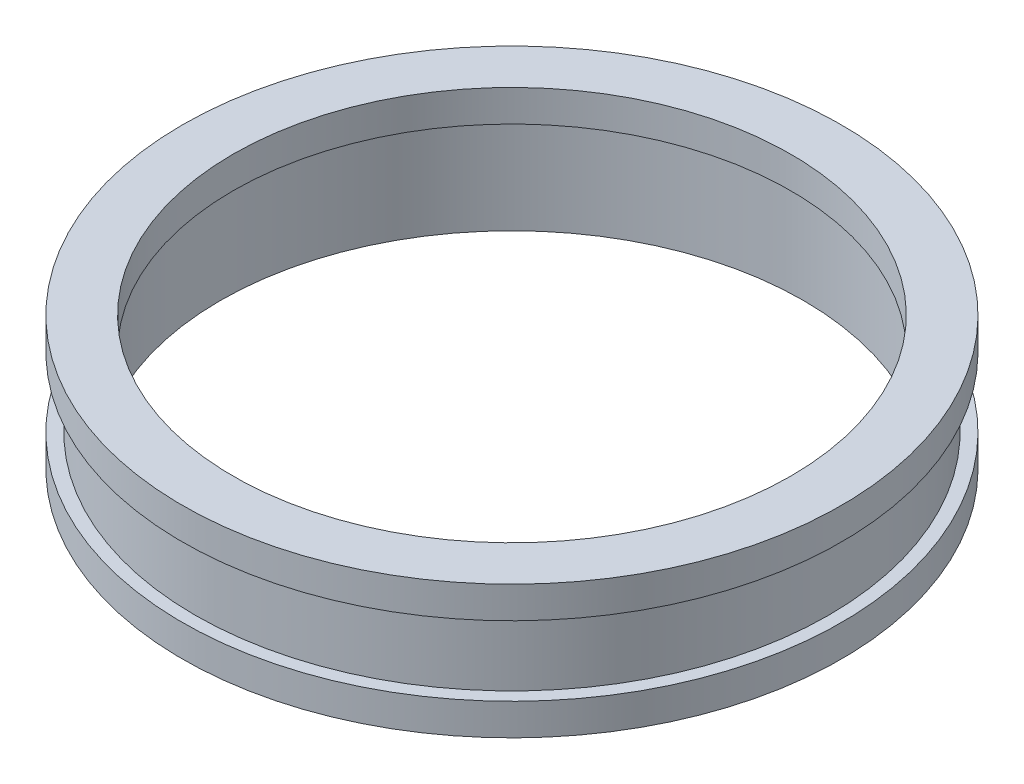
ISO-10303-21;
HEADER;
FILE_DESCRIPTION(('STEP AP214'),'2;1');
FILE_NAME('part.step','',(''),(''),'','','');
FILE_SCHEMA(('AUTOMOTIVE_DESIGN { 1 0 10303 214 1 1 1 1 }'));
ENDSEC;
DATA;
#1=APPLICATION_CONTEXT('core data for automotive mechanical design processes');
#2=APPLICATION_PROTOCOL_DEFINITION('international standard','automotive_design',2000,#1);
#3=PRODUCT_CONTEXT('',#1,'mechanical');
#4=PRODUCT('Part','Part','',(#3));
#5=PRODUCT_RELATED_PRODUCT_CATEGORY('part','',(#4));
#6=PRODUCT_DEFINITION_FORMATION('','',#4);
#7=PRODUCT_DEFINITION_CONTEXT('part definition',#1,'design');
#8=PRODUCT_DEFINITION('design','',#6,#7);
#9=PRODUCT_DEFINITION_SHAPE('','',#8);
#10=(LENGTH_UNIT() NAMED_UNIT(*) SI_UNIT(.MILLI.,.METRE.));
#11=(NAMED_UNIT(*) PLANE_ANGLE_UNIT() SI_UNIT($,.RADIAN.));
#12=(NAMED_UNIT(*) SI_UNIT($,.STERADIAN.) SOLID_ANGLE_UNIT());
#13=UNCERTAINTY_MEASURE_WITH_UNIT(LENGTH_MEASURE(1.E-05),#10,'distance_accuracy_value','');
#14=(GEOMETRIC_REPRESENTATION_CONTEXT(3) GLOBAL_UNCERTAINTY_ASSIGNED_CONTEXT((#13)) GLOBAL_UNIT_ASSIGNED_CONTEXT((#10,
#11,#12)) REPRESENTATION_CONTEXT('',''));
#15=CARTESIAN_POINT('',(0.,0.,0.));
#16=DIRECTION('',(0.,0.,1.));
#17=DIRECTION('',(1.,0.,0.));
#18=AXIS2_PLACEMENT_3D('',#15,#16,#17);
#19=CARTESIAN_POINT('',(44.,4.38119648079913,0.));
#20=DIRECTION('',(0.,1.,0.));
#21=DIRECTION('',(-1.,0.,0.));
#22=AXIS2_PLACEMENT_3D('',#19,#20,#21);
#23=PLANE('',#22);
#24=CARTESIAN_POINT('',(0.,4.38119648079913,0.));
#25=DIRECTION('',(0.,1.,0.));
#26=DIRECTION('',(-1.,0.,0.));
#27=AXIS2_PLACEMENT_3D('',#24,#25,#26);
#28=CIRCLE('',#27,52.);
#29=CARTESIAN_POINT('',(-52.,4.38119648079912,0.));
#30=VERTEX_POINT('',#29);
#31=EDGE_CURVE('E10',#30,#30,#28,.T.);
#32=ORIENTED_EDGE('',*,*,#31,.T.);
#33=EDGE_LOOP('',(#32));
#34=FACE_BOUND('',#33,.T.);
#35=CARTESIAN_POINT('',(0.,4.38119648079913,0.));
#36=DIRECTION('',(0.,1.,0.));
#37=DIRECTION('',(-1.,0.,0.));
#38=AXIS2_PLACEMENT_3D('',#35,#36,#37);
#39=CIRCLE('',#38,44.);
#40=CARTESIAN_POINT('',(-44.,4.38119648079912,0.));
#41=VERTEX_POINT('',#40);
#42=EDGE_CURVE('E65',#41,#41,#39,.T.);
#43=ORIENTED_EDGE('',*,*,#42,.F.);
#44=EDGE_LOOP('',(#43));
#45=FACE_BOUND('',#44,.T.);
#46=ADVANCED_FACE('F31',(#34,#45),#23,.T.);
#47=CARTESIAN_POINT('',(0.,-16.6188035192009,0.));
#48=DIRECTION('',(0.,1.,0.));
#49=DIRECTION('',(-1.,0.,0.));
#50=AXIS2_PLACEMENT_3D('',#47,#48,#49);
#51=CYLINDRICAL_SURFACE('',#50,52.);
#52=CARTESIAN_POINT('',(0.,-0.618803519200871,0.));
#53=DIRECTION('',(0.,1.,0.));
#54=DIRECTION('',(-1.,0.,0.));
#55=AXIS2_PLACEMENT_3D('',#52,#53,#54);
#56=CIRCLE('',#55,52.);
#57=CARTESIAN_POINT('',(-52.,-0.618803519200878,0.));
#58=VERTEX_POINT('',#57);
#59=EDGE_CURVE('E37',#58,#58,#56,.T.);
#60=ORIENTED_EDGE('',*,*,#59,.T.);
#61=EDGE_LOOP('',(#60));
#62=FACE_BOUND('',#61,.T.);
#63=ORIENTED_EDGE('',*,*,#31,.F.);
#64=EDGE_LOOP('',(#63));
#65=FACE_BOUND('',#64,.T.);
#66=ADVANCED_FACE('F73',(#62,#65),#51,.T.);
#67=CARTESIAN_POINT('',(52.,-0.618803519200864,0.));
#68=DIRECTION('',(0.,-1.,0.));
#69=DIRECTION('',(1.,0.,0.));
#70=AXIS2_PLACEMENT_3D('',#67,#68,#69);
#71=PLANE('',#70);
#72=CARTESIAN_POINT('',(0.,-0.618803519200871,0.));
#73=DIRECTION('',(0.,1.,0.));
#74=DIRECTION('',(-1.,0.,0.));
#75=AXIS2_PLACEMENT_3D('',#72,#73,#74);
#76=CIRCLE('',#75,50.);
#77=CARTESIAN_POINT('',(-50.,-0.618803519200878,0.));
#78=VERTEX_POINT('',#77);
#79=EDGE_CURVE('E41',#78,#78,#76,.T.);
#80=ORIENTED_EDGE('',*,*,#79,.T.);
#81=EDGE_LOOP('',(#80));
#82=FACE_BOUND('',#81,.T.);
#83=ORIENTED_EDGE('',*,*,#59,.F.);
#84=EDGE_LOOP('',(#83));
#85=FACE_BOUND('',#84,.T.);
#86=ADVANCED_FACE('F77',(#82,#85),#71,.T.);
#87=CARTESIAN_POINT('',(0.,-16.6188035192009,0.));
#88=DIRECTION('',(0.,1.,0.));
#89=DIRECTION('',(-1.,0.,0.));
#90=AXIS2_PLACEMENT_3D('',#87,#88,#89);
#91=CYLINDRICAL_SURFACE('',#90,50.);
#92=CARTESIAN_POINT('',(0.,-11.6188035192009,0.));
#93=DIRECTION('',(0.,1.,0.));
#94=DIRECTION('',(-1.,0.,0.));
#95=AXIS2_PLACEMENT_3D('',#92,#93,#94);
#96=CIRCLE('',#95,50.);
#97=CARTESIAN_POINT('',(-50.,-11.6188035192009,0.));
#98=VERTEX_POINT('',#97);
#99=EDGE_CURVE('E45',#98,#98,#96,.T.);
#100=ORIENTED_EDGE('',*,*,#99,.T.);
#101=EDGE_LOOP('',(#100));
#102=FACE_BOUND('',#101,.T.);
#103=ORIENTED_EDGE('',*,*,#79,.F.);
#104=EDGE_LOOP('',(#103));
#105=FACE_BOUND('',#104,.T.);
#106=ADVANCED_FACE('F81',(#102,#105),#91,.T.);
#107=CARTESIAN_POINT('',(50.,-11.6188035192009,0.));
#108=DIRECTION('',(0.,1.,0.));
#109=DIRECTION('',(-1.,0.,0.));
#110=AXIS2_PLACEMENT_3D('',#107,#108,#109);
#111=PLANE('',#110);
#112=CARTESIAN_POINT('',(0.,-11.6188035192009,0.));
#113=DIRECTION('',(0.,1.,0.));
#114=DIRECTION('',(-1.,0.,0.));
#115=AXIS2_PLACEMENT_3D('',#112,#113,#114);
#116=CIRCLE('',#115,52.);
#117=CARTESIAN_POINT('',(-52.,-11.6188035192009,0.));
#118=VERTEX_POINT('',#117);
#119=EDGE_CURVE('E50',#118,#118,#116,.T.);
#120=ORIENTED_EDGE('',*,*,#119,.T.);
#121=EDGE_LOOP('',(#120));
#122=FACE_BOUND('',#121,.T.);
#123=ORIENTED_EDGE('',*,*,#99,.F.);
#124=EDGE_LOOP('',(#123));
#125=FACE_BOUND('',#124,.T.);
#126=ADVANCED_FACE('F88',(#122,#125),#111,.T.);
#127=CARTESIAN_POINT('',(0.,-16.6188035192009,0.));
#128=DIRECTION('',(0.,1.,0.));
#129=DIRECTION('',(-1.,0.,0.));
#130=AXIS2_PLACEMENT_3D('',#127,#128,#129);
#131=CYLINDRICAL_SURFACE('',#130,52.);
#132=CARTESIAN_POINT('',(0.,-16.6188035192009,0.));
#133=DIRECTION('',(0.,1.,0.));
#134=DIRECTION('',(-1.,0.,0.));
#135=AXIS2_PLACEMENT_3D('',#132,#133,#134);
#136=CIRCLE('',#135,52.);
#137=CARTESIAN_POINT('',(-52.,-16.6188035192009,0.));
#138=VERTEX_POINT('',#137);
#139=EDGE_CURVE('E53',#138,#138,#136,.T.);
#140=ORIENTED_EDGE('',*,*,#139,.T.);
#141=EDGE_LOOP('',(#140));
#142=FACE_BOUND('',#141,.T.);
#143=ORIENTED_EDGE('',*,*,#119,.F.);
#144=EDGE_LOOP('',(#143));
#145=FACE_BOUND('',#144,.T.);
#146=ADVANCED_FACE('F92',(#142,#145),#131,.T.);
#147=CARTESIAN_POINT('',(52.,-16.6188035192009,0.));
#148=DIRECTION('',(0.,-1.,0.));
#149=DIRECTION('',(1.,0.,0.));
#150=AXIS2_PLACEMENT_3D('',#147,#148,#149);
#151=PLANE('',#150);
#152=CARTESIAN_POINT('',(0.,-16.6188035192009,0.));
#153=DIRECTION('',(0.,1.,0.));
#154=DIRECTION('',(-1.,0.,0.));
#155=AXIS2_PLACEMENT_3D('',#152,#153,#154);
#156=CIRCLE('',#155,46.);
#157=CARTESIAN_POINT('',(-46.,-16.6188035192009,0.));
#158=VERTEX_POINT('',#157);
#159=EDGE_CURVE('E56',#158,#158,#156,.T.);
#160=ORIENTED_EDGE('',*,*,#159,.T.);
#161=EDGE_LOOP('',(#160));
#162=FACE_BOUND('',#161,.T.);
#163=ORIENTED_EDGE('',*,*,#139,.F.);
#164=EDGE_LOOP('',(#163));
#165=FACE_BOUND('',#164,.T.);
#166=ADVANCED_FACE('F96',(#162,#165),#151,.T.);
#167=CARTESIAN_POINT('',(0.,-16.6188035192009,0.));
#168=DIRECTION('',(0.,1.,0.));
#169=DIRECTION('',(-1.,0.,0.));
#170=AXIS2_PLACEMENT_3D('',#167,#168,#169);
#171=CYLINDRICAL_SURFACE('',#170,46.);
#172=CARTESIAN_POINT('',(0.,-0.618803519200871,0.));
#173=DIRECTION('',(0.,1.,0.));
#174=DIRECTION('',(-1.,0.,0.));
#175=AXIS2_PLACEMENT_3D('',#172,#173,#174);
#176=CIRCLE('',#175,46.);
#177=CARTESIAN_POINT('',(-46.,-0.618803519200877,0.));
#178=VERTEX_POINT('',#177);
#179=EDGE_CURVE('E59',#178,#178,#176,.T.);
#180=ORIENTED_EDGE('',*,*,#179,.T.);
#181=EDGE_LOOP('',(#180));
#182=FACE_BOUND('',#181,.T.);
#183=ORIENTED_EDGE('',*,*,#159,.F.);
#184=EDGE_LOOP('',(#183));
#185=FACE_BOUND('',#184,.T.);
#186=ADVANCED_FACE('F100',(#182,#185),#171,.F.);
#187=CARTESIAN_POINT('',(44.,-0.618803519200865,0.));
#188=DIRECTION('',(0.,-1.,0.));
#189=DIRECTION('',(1.,0.,0.));
#190=AXIS2_PLACEMENT_3D('',#187,#188,#189);
#191=PLANE('',#190);
#192=CARTESIAN_POINT('',(0.,-0.618803519200871,0.));
#193=DIRECTION('',(0.,1.,0.));
#194=DIRECTION('',(-1.,0.,0.));
#195=AXIS2_PLACEMENT_3D('',#192,#193,#194);
#196=CIRCLE('',#195,44.);
#197=CARTESIAN_POINT('',(-44.,-0.618803519200877,0.));
#198=VERTEX_POINT('',#197);
#199=EDGE_CURVE('E62',#198,#198,#196,.T.);
#200=ORIENTED_EDGE('',*,*,#199,.T.);
#201=EDGE_LOOP('',(#200));
#202=FACE_BOUND('',#201,.T.);
#203=ORIENTED_EDGE('',*,*,#179,.F.);
#204=EDGE_LOOP('',(#203));
#205=FACE_BOUND('',#204,.T.);
#206=ADVANCED_FACE('F104',(#202,#205),#191,.T.);
#207=CARTESIAN_POINT('',(0.,-16.6188035192009,0.));
#208=DIRECTION('',(0.,1.,0.));
#209=DIRECTION('',(-1.,0.,0.));
#210=AXIS2_PLACEMENT_3D('',#207,#208,#209);
#211=CYLINDRICAL_SURFACE('',#210,44.);
#212=ORIENTED_EDGE('',*,*,#42,.T.);
#213=EDGE_LOOP('',(#212));
#214=FACE_BOUND('',#213,.T.);
#215=ORIENTED_EDGE('',*,*,#199,.F.);
#216=EDGE_LOOP('',(#215));
#217=FACE_BOUND('',#216,.T.);
#218=ADVANCED_FACE('F69',(#214,#217),#211,.F.);
#219=CLOSED_SHELL('',(#46,#66,#86,#106,#126,#146,#166,#186,#206,#218));
#220=MANIFOLD_SOLID_BREP('B2',#219);
#221=ADVANCED_BREP_SHAPE_REPRESENTATION('',(#18,#220),#14);
#222=SHAPE_DEFINITION_REPRESENTATION(#9,#221);
ENDSEC;
END-ISO-10303-21;
